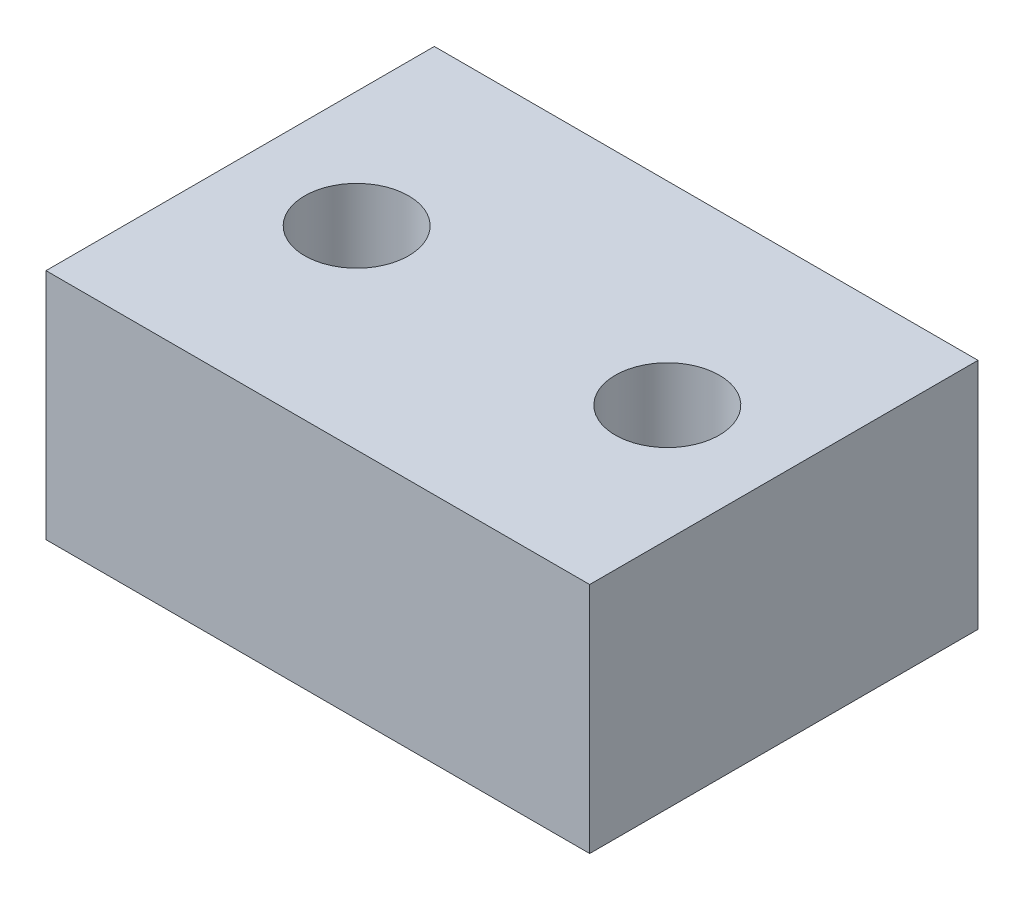
ISO-10303-21;
HEADER;
FILE_DESCRIPTION(('STEP AP214'),'2;1');
FILE_NAME('part.step','',(''),(''),'','','');
FILE_SCHEMA(('AUTOMOTIVE_DESIGN { 1 0 10303 214 1 1 1 1 }'));
ENDSEC;
DATA;
#1=APPLICATION_CONTEXT('core data for automotive mechanical design processes');
#2=APPLICATION_PROTOCOL_DEFINITION('international standard','automotive_design',2000,#1);
#3=PRODUCT_CONTEXT('',#1,'mechanical');
#4=PRODUCT('Part','Part','',(#3));
#5=PRODUCT_RELATED_PRODUCT_CATEGORY('part','',(#4));
#6=PRODUCT_DEFINITION_FORMATION('','',#4);
#7=PRODUCT_DEFINITION_CONTEXT('part definition',#1,'design');
#8=PRODUCT_DEFINITION('design','',#6,#7);
#9=PRODUCT_DEFINITION_SHAPE('','',#8);
#10=(LENGTH_UNIT() NAMED_UNIT(*) SI_UNIT(.MILLI.,.METRE.));
#11=(NAMED_UNIT(*) PLANE_ANGLE_UNIT() SI_UNIT($,.RADIAN.));
#12=(NAMED_UNIT(*) SI_UNIT($,.STERADIAN.) SOLID_ANGLE_UNIT());
#13=UNCERTAINTY_MEASURE_WITH_UNIT(LENGTH_MEASURE(1.E-05),#10,'distance_accuracy_value','');
#14=(GEOMETRIC_REPRESENTATION_CONTEXT(3) GLOBAL_UNCERTAINTY_ASSIGNED_CONTEXT((#13)) GLOBAL_UNIT_ASSIGNED_CONTEXT((#10,
#11,#12)) REPRESENTATION_CONTEXT('',''));
#15=CARTESIAN_POINT('',(0.,0.,0.));
#16=DIRECTION('',(0.,0.,1.));
#17=DIRECTION('',(1.,0.,0.));
#18=AXIS2_PLACEMENT_3D('',#15,#16,#17);
#19=CARTESIAN_POINT('',(0.,7.62,0.));
#20=DIRECTION('',(0.,-1.,0.));
#21=DIRECTION('',(0.,0.,-1.));
#22=AXIS2_PLACEMENT_3D('',#19,#20,#21);
#23=PLANE('',#22);
#24=DIRECTION('',(0.,0.,1.));
#25=VECTOR('',#24,1.);
#26=CARTESIAN_POINT('',(0.,7.62,0.));
#27=LINE('',#26,#25);
#28=CARTESIAN_POINT('',(0.,7.62,-12.7));
#29=VERTEX_POINT('',#28);
#30=CARTESIAN_POINT('',(0.,7.62,0.));
#31=VERTEX_POINT('',#30);
#32=EDGE_CURVE('E91',#29,#31,#27,.T.);
#33=ORIENTED_EDGE('',*,*,#32,.T.);
#34=DIRECTION('',(1.,0.,0.));
#35=VECTOR('',#34,1.);
#36=CARTESIAN_POINT('',(0.,7.62,0.));
#37=LINE('',#36,#35);
#38=CARTESIAN_POINT('',(17.78,7.62,0.));
#39=VERTEX_POINT('',#38);
#40=EDGE_CURVE('E86',#31,#39,#37,.T.);
#41=ORIENTED_EDGE('',*,*,#40,.T.);
#42=DIRECTION('',(0.,0.,-1.));
#43=VECTOR('',#42,1.);
#44=CARTESIAN_POINT('',(17.78,7.62,0.));
#45=LINE('',#44,#43);
#46=CARTESIAN_POINT('',(17.78,7.62,-12.7));
#47=VERTEX_POINT('',#46);
#48=EDGE_CURVE('E89',#39,#47,#45,.T.);
#49=ORIENTED_EDGE('',*,*,#48,.T.);
#50=DIRECTION('',(-1.,0.,0.));
#51=VECTOR('',#50,1.);
#52=CARTESIAN_POINT('',(0.,7.62,-12.7));
#53=LINE('',#52,#51);
#54=EDGE_CURVE('E56',#47,#29,#53,.T.);
#55=ORIENTED_EDGE('',*,*,#54,.T.);
#56=EDGE_LOOP('',(#33,#41,#49,#55));
#57=FACE_BOUND('',#56,.T.);
#58=CARTESIAN_POINT('',(3.81,7.62,-6.35));
#59=DIRECTION('',(0.,1.,0.));
#60=DIRECTION('',(0.,0.,1.));
#61=AXIS2_PLACEMENT_3D('',#58,#59,#60);
#62=CIRCLE('',#61,1.7);
#63=CARTESIAN_POINT('',(3.81,7.62,-8.05));
#64=VERTEX_POINT('',#63);
#65=EDGE_CURVE('E106',#64,#64,#62,.T.);
#66=ORIENTED_EDGE('',*,*,#65,.F.);
#67=EDGE_LOOP('',(#66));
#68=FACE_BOUND('',#67,.T.);
#69=CARTESIAN_POINT('',(13.97,7.62,-6.35));
#70=DIRECTION('',(0.,1.,0.));
#71=DIRECTION('',(0.,0.,1.));
#72=AXIS2_PLACEMENT_3D('',#69,#70,#71);
#73=CIRCLE('',#72,1.7);
#74=CARTESIAN_POINT('',(13.97,7.62,-8.05));
#75=VERTEX_POINT('',#74);
#76=EDGE_CURVE('E121',#75,#75,#73,.T.);
#77=ORIENTED_EDGE('',*,*,#76,.F.);
#78=EDGE_LOOP('',(#77));
#79=FACE_BOUND('',#78,.T.);
#80=ADVANCED_FACE('F39',(#57,#68,#79),#23,.F.);
#81=CARTESIAN_POINT('',(0.,0.,0.));
#82=DIRECTION('',(0.,-1.,0.));
#83=DIRECTION('',(0.,0.,-1.));
#84=AXIS2_PLACEMENT_3D('',#81,#82,#83);
#85=PLANE('',#84);
#86=CARTESIAN_POINT('',(3.81,0.,-6.35));
#87=DIRECTION('',(0.,1.,0.));
#88=DIRECTION('',(0.,0.,1.));
#89=AXIS2_PLACEMENT_3D('',#86,#87,#88);
#90=CIRCLE('',#89,1.7);
#91=CARTESIAN_POINT('',(3.81,0.,-8.05));
#92=VERTEX_POINT('',#91);
#93=EDGE_CURVE('E118',#92,#92,#90,.T.);
#94=ORIENTED_EDGE('',*,*,#93,.T.);
#95=EDGE_LOOP('',(#94));
#96=FACE_BOUND('',#95,.T.);
#97=DIRECTION('',(0.,0.,1.));
#98=VECTOR('',#97,1.);
#99=CARTESIAN_POINT('',(0.,0.,0.));
#100=LINE('',#99,#98);
#101=CARTESIAN_POINT('',(0.,0.,-12.7));
#102=VERTEX_POINT('',#101);
#103=CARTESIAN_POINT('',(0.,0.,0.));
#104=VERTEX_POINT('',#103);
#105=EDGE_CURVE('E103',#102,#104,#100,.T.);
#106=ORIENTED_EDGE('',*,*,#105,.F.);
#107=DIRECTION('',(-1.,0.,0.));
#108=VECTOR('',#107,1.);
#109=CARTESIAN_POINT('',(0.,0.,-12.7));
#110=LINE('',#109,#108);
#111=CARTESIAN_POINT('',(17.78,0.,-12.7));
#112=VERTEX_POINT('',#111);
#113=EDGE_CURVE('E79',#112,#102,#110,.T.);
#114=ORIENTED_EDGE('',*,*,#113,.F.);
#115=DIRECTION('',(0.,0.,-1.));
#116=VECTOR('',#115,1.);
#117=CARTESIAN_POINT('',(17.78,0.,0.));
#118=LINE('',#117,#116);
#119=CARTESIAN_POINT('',(17.78,0.,0.));
#120=VERTEX_POINT('',#119);
#121=EDGE_CURVE('E73',#120,#112,#118,.T.);
#122=ORIENTED_EDGE('',*,*,#121,.F.);
#123=DIRECTION('',(1.,0.,0.));
#124=VECTOR('',#123,1.);
#125=CARTESIAN_POINT('',(0.,0.,0.));
#126=LINE('',#125,#124);
#127=EDGE_CURVE('E95',#104,#120,#126,.T.);
#128=ORIENTED_EDGE('',*,*,#127,.F.);
#129=EDGE_LOOP('',(#106,#114,#122,#128));
#130=FACE_BOUND('',#129,.T.);
#131=CARTESIAN_POINT('',(13.97,0.,-6.35));
#132=DIRECTION('',(0.,1.,0.));
#133=DIRECTION('',(0.,0.,1.));
#134=AXIS2_PLACEMENT_3D('',#131,#132,#133);
#135=CIRCLE('',#134,1.7);
#136=CARTESIAN_POINT('',(13.97,0.,-8.05));
#137=VERTEX_POINT('',#136);
#138=EDGE_CURVE('E124',#137,#137,#135,.T.);
#139=ORIENTED_EDGE('',*,*,#138,.T.);
#140=EDGE_LOOP('',(#139));
#141=FACE_BOUND('',#140,.T.);
#142=ADVANCED_FACE('F114',(#96,#130,#141),#85,.T.);
#143=CARTESIAN_POINT('',(0.,7.62,0.));
#144=DIRECTION('',(1.,0.,0.));
#145=DIRECTION('',(0.,0.,-1.));
#146=AXIS2_PLACEMENT_3D('',#143,#144,#145);
#147=PLANE('',#146);
#148=ORIENTED_EDGE('',*,*,#105,.T.);
#149=DIRECTION('',(0.,-1.,0.));
#150=VECTOR('',#149,1.);
#151=CARTESIAN_POINT('',(0.,7.62,0.));
#152=LINE('',#151,#150);
#153=EDGE_CURVE('E11',#31,#104,#152,.T.);
#154=ORIENTED_EDGE('',*,*,#153,.F.);
#155=ORIENTED_EDGE('',*,*,#32,.F.);
#156=DIRECTION('',(0.,-1.,0.));
#157=VECTOR('',#156,1.);
#158=CARTESIAN_POINT('',(0.,7.62,-12.7));
#159=LINE('',#158,#157);
#160=EDGE_CURVE('E99',#29,#102,#159,.T.);
#161=ORIENTED_EDGE('',*,*,#160,.T.);
#162=EDGE_LOOP('',(#148,#154,#155,#161));
#163=FACE_BOUND('',#162,.T.);
#164=ADVANCED_FACE('F41',(#163),#147,.F.);
#165=CARTESIAN_POINT('',(0.,7.62,0.));
#166=DIRECTION('',(0.,0.,-1.));
#167=DIRECTION('',(-1.,0.,0.));
#168=AXIS2_PLACEMENT_3D('',#165,#166,#167);
#169=PLANE('',#168);
#170=ORIENTED_EDGE('',*,*,#127,.T.);
#171=DIRECTION('',(0.,-1.,0.));
#172=VECTOR('',#171,1.);
#173=CARTESIAN_POINT('',(17.78,7.62,0.));
#174=LINE('',#173,#172);
#175=EDGE_CURVE('E48',#39,#120,#174,.T.);
#176=ORIENTED_EDGE('',*,*,#175,.F.);
#177=ORIENTED_EDGE('',*,*,#40,.F.);
#178=ORIENTED_EDGE('',*,*,#153,.T.);
#179=EDGE_LOOP('',(#170,#176,#177,#178));
#180=FACE_BOUND('',#179,.T.);
#181=ADVANCED_FACE('F94',(#180),#169,.F.);
#182=CARTESIAN_POINT('',(17.78,7.62,0.));
#183=DIRECTION('',(-1.,0.,0.));
#184=DIRECTION('',(0.,0.,1.));
#185=AXIS2_PLACEMENT_3D('',#182,#183,#184);
#186=PLANE('',#185);
#187=ORIENTED_EDGE('',*,*,#121,.T.);
#188=DIRECTION('',(0.,-1.,0.));
#189=VECTOR('',#188,1.);
#190=CARTESIAN_POINT('',(17.78,7.62,-12.7));
#191=LINE('',#190,#189);
#192=EDGE_CURVE('E96',#47,#112,#191,.T.);
#193=ORIENTED_EDGE('',*,*,#192,.F.);
#194=ORIENTED_EDGE('',*,*,#48,.F.);
#195=ORIENTED_EDGE('',*,*,#175,.T.);
#196=EDGE_LOOP('',(#187,#193,#194,#195));
#197=FACE_BOUND('',#196,.T.);
#198=ADVANCED_FACE('F97',(#197),#186,.F.);
#199=CARTESIAN_POINT('',(0.,7.62,-12.7));
#200=DIRECTION('',(0.,0.,1.));
#201=DIRECTION('',(1.,0.,0.));
#202=AXIS2_PLACEMENT_3D('',#199,#200,#201);
#203=PLANE('',#202);
#204=ORIENTED_EDGE('',*,*,#113,.T.);
#205=ORIENTED_EDGE('',*,*,#160,.F.);
#206=ORIENTED_EDGE('',*,*,#54,.F.);
#207=ORIENTED_EDGE('',*,*,#192,.T.);
#208=EDGE_LOOP('',(#204,#205,#206,#207));
#209=FACE_BOUND('',#208,.T.);
#210=ADVANCED_FACE('F111',(#209),#203,.F.);
#211=CARTESIAN_POINT('',(3.81,7.62,-6.35));
#212=DIRECTION('',(0.,-1.,0.));
#213=DIRECTION('',(0.,0.,-1.));
#214=AXIS2_PLACEMENT_3D('',#211,#212,#213);
#215=CYLINDRICAL_SURFACE('',#214,1.7);
#216=CARTESIAN_POINT('',(3.81,7.62,-8.05));
#217=CARTESIAN_POINT('',(3.81,7.540625,-8.05));
#218=CARTESIAN_POINT('',(3.81,7.46125,-8.05));
#219=CARTESIAN_POINT('',(3.81,7.3025,-8.05));
#220=CARTESIAN_POINT('',(3.81,7.223125,-8.05));
#221=CARTESIAN_POINT('',(3.81,7.064375,-8.05));
#222=CARTESIAN_POINT('',(3.81,6.985,-8.05));
#223=CARTESIAN_POINT('',(3.81,6.82625,-8.05));
#224=CARTESIAN_POINT('',(3.81,6.746875,-8.05));
#225=CARTESIAN_POINT('',(3.81,6.588125,-8.05));
#226=CARTESIAN_POINT('',(3.81,6.50875,-8.05));
#227=CARTESIAN_POINT('',(3.81,6.35,-8.05));
#228=CARTESIAN_POINT('',(3.81,6.270625,-8.05));
#229=CARTESIAN_POINT('',(3.81,6.111875,-8.05));
#230=CARTESIAN_POINT('',(3.81,6.0325,-8.05));
#231=CARTESIAN_POINT('',(3.81,5.87375,-8.05));
#232=CARTESIAN_POINT('',(3.81,5.794375,-8.05));
#233=CARTESIAN_POINT('',(3.81,5.635625,-8.05));
#234=CARTESIAN_POINT('',(3.81,5.55625,-8.05));
#235=CARTESIAN_POINT('',(3.81,5.3975,-8.05));
#236=CARTESIAN_POINT('',(3.81,5.318125,-8.05));
#237=CARTESIAN_POINT('',(3.81,5.159375,-8.05));
#238=CARTESIAN_POINT('',(3.81,5.08,-8.05));
#239=CARTESIAN_POINT('',(3.81,4.92125,-8.05));
#240=CARTESIAN_POINT('',(3.81,4.841875,-8.05));
#241=CARTESIAN_POINT('',(3.81,4.683125,-8.05));
#242=CARTESIAN_POINT('',(3.81,4.60375,-8.05));
#243=CARTESIAN_POINT('',(3.81,4.445,-8.05));
#244=CARTESIAN_POINT('',(3.81,4.365625,-8.05));
#245=CARTESIAN_POINT('',(3.81,4.206875,-8.05));
#246=CARTESIAN_POINT('',(3.81,4.1275,-8.05));
#247=CARTESIAN_POINT('',(3.81,3.96875,-8.05));
#248=CARTESIAN_POINT('',(3.81,3.889375,-8.05));
#249=CARTESIAN_POINT('',(3.81,3.730625,-8.05));
#250=CARTESIAN_POINT('',(3.81,3.65125,-8.05));
#251=CARTESIAN_POINT('',(3.81,3.4925,-8.05));
#252=CARTESIAN_POINT('',(3.81,3.413125,-8.05));
#253=CARTESIAN_POINT('',(3.81,3.254375,-8.05));
#254=CARTESIAN_POINT('',(3.81,3.175,-8.05));
#255=CARTESIAN_POINT('',(3.81,3.01625,-8.05));
#256=CARTESIAN_POINT('',(3.81,2.936875,-8.05));
#257=CARTESIAN_POINT('',(3.81,2.778125,-8.05));
#258=CARTESIAN_POINT('',(3.81,2.69875,-8.05));
#259=CARTESIAN_POINT('',(3.81,2.54,-8.05));
#260=CARTESIAN_POINT('',(3.81,2.460625,-8.05));
#261=CARTESIAN_POINT('',(3.81,2.301875,-8.05));
#262=CARTESIAN_POINT('',(3.81,2.2225,-8.05));
#263=CARTESIAN_POINT('',(3.81,2.06375,-8.05));
#264=CARTESIAN_POINT('',(3.81,1.984375,-8.05));
#265=CARTESIAN_POINT('',(3.81,1.825625,-8.05));
#266=CARTESIAN_POINT('',(3.81,1.74625,-8.05));
#267=CARTESIAN_POINT('',(3.81,1.5875,-8.05));
#268=CARTESIAN_POINT('',(3.81,1.508125,-8.05));
#269=CARTESIAN_POINT('',(3.81,1.349375,-8.05));
#270=CARTESIAN_POINT('',(3.81,1.27,-8.05));
#271=CARTESIAN_POINT('',(3.81,1.11125,-8.05));
#272=CARTESIAN_POINT('',(3.81,1.031875,-8.05));
#273=CARTESIAN_POINT('',(3.81,0.873125,-8.05));
#274=CARTESIAN_POINT('',(3.81,0.79375,-8.05));
#275=CARTESIAN_POINT('',(3.81,0.635,-8.05));
#276=CARTESIAN_POINT('',(3.81,0.555625,-8.05));
#277=CARTESIAN_POINT('',(3.81,0.396875,-8.05));
#278=CARTESIAN_POINT('',(3.81,0.3175,-8.05));
#279=CARTESIAN_POINT('',(3.81,0.15875,-8.05));
#280=CARTESIAN_POINT('',(3.81,0.0793749999999999,-8.05));
#281=CARTESIAN_POINT('',(3.81,0.,-8.05));
#282=B_SPLINE_CURVE_WITH_KNOTS('',3,(#216,#217,#218,#219,#220,#221,#222,#223,#224,#225,#226,
#227,#228,#229,#230,#231,#232,#233,#234,#235,#236,#237,#238,#239,#240,#241,#242,#243,#244,#245,
#246,#247,#248,#249,#250,#251,#252,#253,#254,#255,#256,#257,#258,#259,#260,#261,#262,#263,#264,
#265,#266,#267,#268,#269,#270,#271,#272,#273,#274,#275,#276,#277,#278,#279,#280,#281),
.UNSPECIFIED.,.F.,.F.,(4,2,2,2,2,2,2,2,2,2,2,2,2,2,2,2,2,2,2,2,2,2,2,2,2,2,2,2,2,2,2,2,4),(0.,
0.238125,0.47625,0.714375000000001,0.9525,1.190625,1.42875,1.666875,1.905,2.143125,2.38125,
2.619375,2.8575,3.095625,3.33375,3.571875,3.81,4.048125,4.28625,4.524375,4.7625,5.000625,
5.23875,5.476875,5.715,5.953125,6.19125,6.429375,6.6675,6.905625,7.14375,7.381875,7.62),.UNSPECIFIED.);
#283=EDGE_CURVE('BSEAM141',#64,#92,#282,.T.);
#284=ORIENTED_EDGE('',*,*,#65,.T.);
#285=ORIENTED_EDGE('',*,*,#93,.F.);
#286=ORIENTED_EDGE('',*,*,#283,.T.);
#287=ORIENTED_EDGE('',*,*,#283,.F.);
#288=EDGE_LOOP('',(#284,#286,#285,#287));
#289=FACE_BOUND('',#288,.T.);
#290=ADVANCED_FACE('F141',(#289),#215,.F.);
#291=CARTESIAN_POINT('',(13.97,7.62,-6.35));
#292=DIRECTION('',(0.,-1.,0.));
#293=DIRECTION('',(0.,0.,-1.));
#294=AXIS2_PLACEMENT_3D('',#291,#292,#293);
#295=CYLINDRICAL_SURFACE('',#294,1.7);
#296=CARTESIAN_POINT('',(13.97,7.62,-8.05));
#297=CARTESIAN_POINT('',(13.97,7.540625,-8.05));
#298=CARTESIAN_POINT('',(13.97,7.46125,-8.05));
#299=CARTESIAN_POINT('',(13.97,7.3025,-8.05));
#300=CARTESIAN_POINT('',(13.97,7.223125,-8.05));
#301=CARTESIAN_POINT('',(13.97,7.064375,-8.05));
#302=CARTESIAN_POINT('',(13.97,6.985,-8.05));
#303=CARTESIAN_POINT('',(13.97,6.82625,-8.05));
#304=CARTESIAN_POINT('',(13.97,6.746875,-8.05));
#305=CARTESIAN_POINT('',(13.97,6.588125,-8.05));
#306=CARTESIAN_POINT('',(13.97,6.50875,-8.05));
#307=CARTESIAN_POINT('',(13.97,6.35,-8.05));
#308=CARTESIAN_POINT('',(13.97,6.270625,-8.05));
#309=CARTESIAN_POINT('',(13.97,6.111875,-8.05));
#310=CARTESIAN_POINT('',(13.97,6.0325,-8.05));
#311=CARTESIAN_POINT('',(13.97,5.87375,-8.05));
#312=CARTESIAN_POINT('',(13.97,5.794375,-8.05));
#313=CARTESIAN_POINT('',(13.97,5.635625,-8.05));
#314=CARTESIAN_POINT('',(13.97,5.55625,-8.05));
#315=CARTESIAN_POINT('',(13.97,5.3975,-8.05));
#316=CARTESIAN_POINT('',(13.97,5.318125,-8.05));
#317=CARTESIAN_POINT('',(13.97,5.159375,-8.05));
#318=CARTESIAN_POINT('',(13.97,5.08,-8.05));
#319=CARTESIAN_POINT('',(13.97,4.92125,-8.05));
#320=CARTESIAN_POINT('',(13.97,4.841875,-8.05));
#321=CARTESIAN_POINT('',(13.97,4.683125,-8.05));
#322=CARTESIAN_POINT('',(13.97,4.60375,-8.05));
#323=CARTESIAN_POINT('',(13.97,4.445,-8.05));
#324=CARTESIAN_POINT('',(13.97,4.365625,-8.05));
#325=CARTESIAN_POINT('',(13.97,4.206875,-8.05));
#326=CARTESIAN_POINT('',(13.97,4.1275,-8.05));
#327=CARTESIAN_POINT('',(13.97,3.96875,-8.05));
#328=CARTESIAN_POINT('',(13.97,3.889375,-8.05));
#329=CARTESIAN_POINT('',(13.97,3.730625,-8.05));
#330=CARTESIAN_POINT('',(13.97,3.65125,-8.05));
#331=CARTESIAN_POINT('',(13.97,3.4925,-8.05));
#332=CARTESIAN_POINT('',(13.97,3.413125,-8.05));
#333=CARTESIAN_POINT('',(13.97,3.254375,-8.05));
#334=CARTESIAN_POINT('',(13.97,3.175,-8.05));
#335=CARTESIAN_POINT('',(13.97,3.01625,-8.05));
#336=CARTESIAN_POINT('',(13.97,2.936875,-8.05));
#337=CARTESIAN_POINT('',(13.97,2.778125,-8.05));
#338=CARTESIAN_POINT('',(13.97,2.69875,-8.05));
#339=CARTESIAN_POINT('',(13.97,2.54,-8.05));
#340=CARTESIAN_POINT('',(13.97,2.460625,-8.05));
#341=CARTESIAN_POINT('',(13.97,2.301875,-8.05));
#342=CARTESIAN_POINT('',(13.97,2.2225,-8.05));
#343=CARTESIAN_POINT('',(13.97,2.06375,-8.05));
#344=CARTESIAN_POINT('',(13.97,1.984375,-8.05));
#345=CARTESIAN_POINT('',(13.97,1.825625,-8.05));
#346=CARTESIAN_POINT('',(13.97,1.74625,-8.05));
#347=CARTESIAN_POINT('',(13.97,1.5875,-8.05));
#348=CARTESIAN_POINT('',(13.97,1.508125,-8.05));
#349=CARTESIAN_POINT('',(13.97,1.349375,-8.05));
#350=CARTESIAN_POINT('',(13.97,1.27,-8.05));
#351=CARTESIAN_POINT('',(13.97,1.11125,-8.05));
#352=CARTESIAN_POINT('',(13.97,1.031875,-8.05));
#353=CARTESIAN_POINT('',(13.97,0.873125,-8.05));
#354=CARTESIAN_POINT('',(13.97,0.79375,-8.05));
#355=CARTESIAN_POINT('',(13.97,0.635,-8.05));
#356=CARTESIAN_POINT('',(13.97,0.555625,-8.05));
#357=CARTESIAN_POINT('',(13.97,0.396875,-8.05));
#358=CARTESIAN_POINT('',(13.97,0.3175,-8.05));
#359=CARTESIAN_POINT('',(13.97,0.15875,-8.05));
#360=CARTESIAN_POINT('',(13.97,0.0793749999999999,-8.05));
#361=CARTESIAN_POINT('',(13.97,0.,-8.05));
#362=B_SPLINE_CURVE_WITH_KNOTS('',3,(#296,#297,#298,#299,#300,#301,#302,#303,#304,#305,#306,
#307,#308,#309,#310,#311,#312,#313,#314,#315,#316,#317,#318,#319,#320,#321,#322,#323,#324,#325,
#326,#327,#328,#329,#330,#331,#332,#333,#334,#335,#336,#337,#338,#339,#340,#341,#342,#343,#344,
#345,#346,#347,#348,#349,#350,#351,#352,#353,#354,#355,#356,#357,#358,#359,#360,#361),
.UNSPECIFIED.,.F.,.F.,(4,2,2,2,2,2,2,2,2,2,2,2,2,2,2,2,2,2,2,2,2,2,2,2,2,2,2,2,2,2,2,2,4),(0.,
0.238125,0.47625,0.714375000000001,0.9525,1.190625,1.42875,1.666875,1.905,2.143125,2.38125,
2.619375,2.8575,3.095625,3.33375,3.571875,3.81,4.048125,4.28625,4.524375,4.7625,5.000625,
5.23875,5.476875,5.715,5.953125,6.19125,6.429375,6.6675,6.905625,7.14375,7.381875,7.62),.UNSPECIFIED.);
#363=EDGE_CURVE('BSEAM130',#75,#137,#362,.T.);
#364=ORIENTED_EDGE('',*,*,#76,.T.);
#365=ORIENTED_EDGE('',*,*,#138,.F.);
#366=ORIENTED_EDGE('',*,*,#363,.T.);
#367=ORIENTED_EDGE('',*,*,#363,.F.);
#368=EDGE_LOOP('',(#364,#366,#365,#367));
#369=FACE_BOUND('',#368,.T.);
#370=ADVANCED_FACE('F130',(#369),#295,.F.);
#371=CLOSED_SHELL('',(#80,#142,#164,#181,#198,#210,#290,#370));
#372=MANIFOLD_SOLID_BREP('B2',#371);
#373=ADVANCED_BREP_SHAPE_REPRESENTATION('',(#18,#372),#14);
#374=SHAPE_DEFINITION_REPRESENTATION(#9,#373);
ENDSEC;
END-ISO-10303-21;
